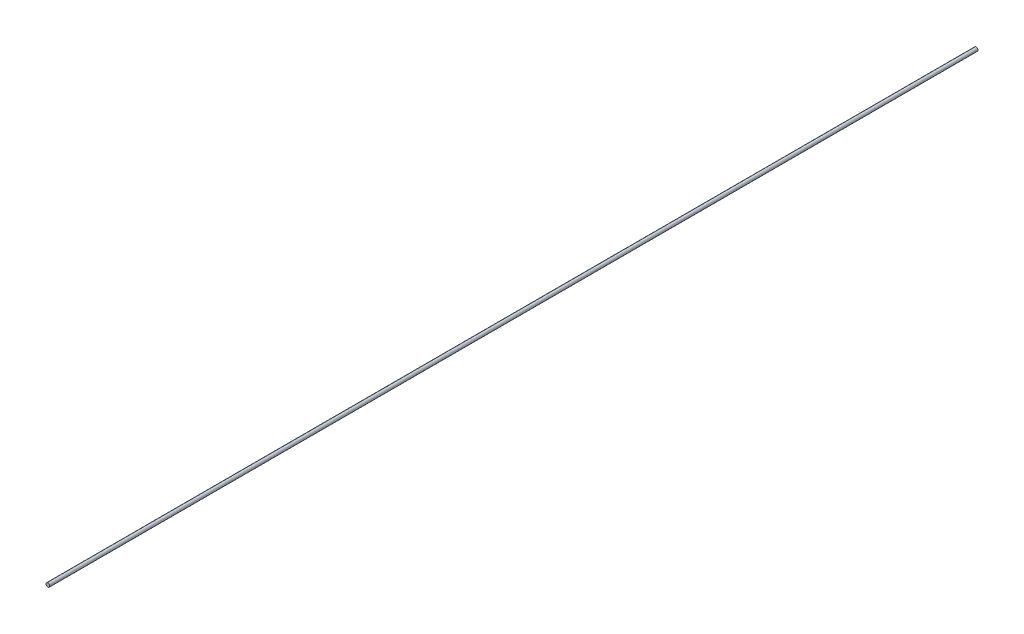
ISO-10303-21;
HEADER;
FILE_DESCRIPTION(('STEP AP214'),'2;1');
FILE_NAME('part.step','',(''),(''),'','','');
FILE_SCHEMA(('AUTOMOTIVE_DESIGN { 1 0 10303 214 1 1 1 1 }'));
ENDSEC;
DATA;
#1=APPLICATION_CONTEXT('core data for automotive mechanical design processes');
#2=APPLICATION_PROTOCOL_DEFINITION('international standard','automotive_design',2000,#1);
#3=PRODUCT_CONTEXT('',#1,'mechanical');
#4=PRODUCT('Part','Part','',(#3));
#5=PRODUCT_RELATED_PRODUCT_CATEGORY('part','',(#4));
#6=PRODUCT_DEFINITION_FORMATION('','',#4);
#7=PRODUCT_DEFINITION_CONTEXT('part definition',#1,'design');
#8=PRODUCT_DEFINITION('design','',#6,#7);
#9=PRODUCT_DEFINITION_SHAPE('','',#8);
#10=(LENGTH_UNIT() NAMED_UNIT(*) SI_UNIT(.MILLI.,.METRE.));
#11=(NAMED_UNIT(*) PLANE_ANGLE_UNIT() SI_UNIT($,.RADIAN.));
#12=(NAMED_UNIT(*) SI_UNIT($,.STERADIAN.) SOLID_ANGLE_UNIT());
#13=UNCERTAINTY_MEASURE_WITH_UNIT(LENGTH_MEASURE(1.E-05),#10,'distance_accuracy_value','');
#14=(GEOMETRIC_REPRESENTATION_CONTEXT(3) GLOBAL_UNCERTAINTY_ASSIGNED_CONTEXT((#13)) GLOBAL_UNIT_ASSIGNED_CONTEXT((#10,
#11,#12)) REPRESENTATION_CONTEXT('',''));
#15=CARTESIAN_POINT('',(0.,0.,0.));
#16=DIRECTION('',(0.,0.,1.));
#17=DIRECTION('',(1.,0.,0.));
#18=AXIS2_PLACEMENT_3D('',#15,#16,#17);
#19=CARTESIAN_POINT('',(0.,0.,500.));
#20=DIRECTION('',(0.,0.,-1.));
#21=DIRECTION('',(-1.,0.,0.));
#22=AXIS2_PLACEMENT_3D('',#19,#20,#21);
#23=CYLINDRICAL_SURFACE('',#22,1.);
#24=CARTESIAN_POINT('',(0.,0.,500.));
#25=DIRECTION('',(0.,0.,1.));
#26=DIRECTION('',(1.,0.,0.));
#27=AXIS2_PLACEMENT_3D('',#24,#25,#26);
#28=CIRCLE('',#27,1.);
#29=CARTESIAN_POINT('',(1.,0.,500.));
#30=VERTEX_POINT('',#29);
#31=EDGE_CURVE('E10',#30,#30,#28,.T.);
#32=ORIENTED_EDGE('',*,*,#31,.F.);
#33=EDGE_LOOP('',(#32));
#34=FACE_BOUND('',#33,.T.);
#35=CARTESIAN_POINT('',(0.,0.,0.));
#36=DIRECTION('',(0.,0.,1.));
#37=DIRECTION('',(1.,0.,0.));
#38=AXIS2_PLACEMENT_3D('',#35,#36,#37);
#39=CIRCLE('',#38,1.);
#40=CARTESIAN_POINT('',(1.,0.,0.));
#41=VERTEX_POINT('',#40);
#42=EDGE_CURVE('E36',#41,#41,#39,.T.);
#43=ORIENTED_EDGE('',*,*,#42,.T.);
#44=EDGE_LOOP('',(#43));
#45=FACE_BOUND('',#44,.T.);
#46=ADVANCED_FACE('F33',(#34,#45),#23,.T.);
#47=CARTESIAN_POINT('',(0.,0.,500.));
#48=DIRECTION('',(0.,0.,1.));
#49=DIRECTION('',(1.,0.,0.));
#50=AXIS2_PLACEMENT_3D('',#47,#48,#49);
#51=PLANE('',#50);
#52=ORIENTED_EDGE('',*,*,#31,.T.);
#53=EDGE_LOOP('',(#52));
#54=FACE_BOUND('',#53,.T.);
#55=ADVANCED_FACE('F48',(#54),#51,.T.);
#56=CARTESIAN_POINT('',(0.,0.,0.));
#57=DIRECTION('',(0.,0.,1.));
#58=DIRECTION('',(1.,0.,0.));
#59=AXIS2_PLACEMENT_3D('',#56,#57,#58);
#60=PLANE('',#59);
#61=ORIENTED_EDGE('',*,*,#42,.F.);
#62=EDGE_LOOP('',(#61));
#63=FACE_BOUND('',#62,.T.);
#64=ADVANCED_FACE('F46',(#63),#60,.F.);
#65=CLOSED_SHELL('',(#46,#55,#64));
#66=MANIFOLD_SOLID_BREP('B2',#65);
#67=ADVANCED_BREP_SHAPE_REPRESENTATION('',(#18,#66),#14);
#68=SHAPE_DEFINITION_REPRESENTATION(#9,#67);
ENDSEC;
END-ISO-10303-21;
